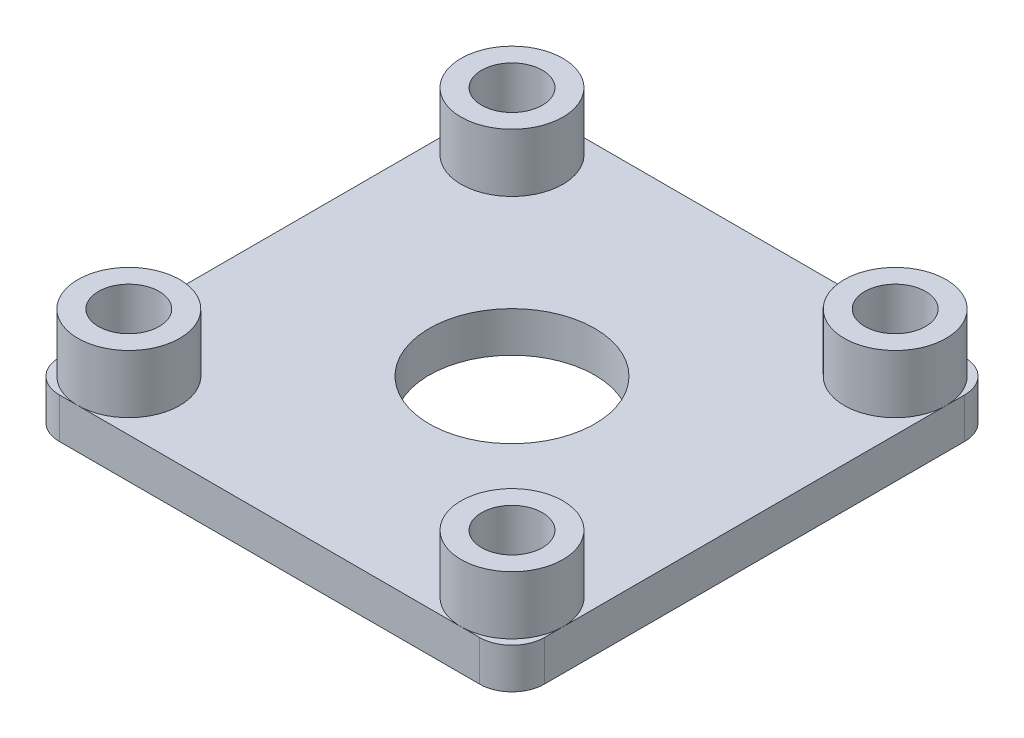
ISO-10303-21;
HEADER;
FILE_DESCRIPTION(('STEP AP214'),'2;1');
FILE_NAME('part.step','',(''),(''),'','','');
FILE_SCHEMA(('AUTOMOTIVE_DESIGN { 1 0 10303 214 1 1 1 1 }'));
ENDSEC;
DATA;
#1=APPLICATION_CONTEXT('core data for automotive mechanical design processes');
#2=APPLICATION_PROTOCOL_DEFINITION('international standard','automotive_design',2000,#1);
#3=PRODUCT_CONTEXT('',#1,'mechanical');
#4=PRODUCT('Part','Part','',(#3));
#5=PRODUCT_RELATED_PRODUCT_CATEGORY('part','',(#4));
#6=PRODUCT_DEFINITION_FORMATION('','',#4);
#7=PRODUCT_DEFINITION_CONTEXT('part definition',#1,'design');
#8=PRODUCT_DEFINITION('design','',#6,#7);
#9=PRODUCT_DEFINITION_SHAPE('','',#8);
#10=(LENGTH_UNIT() NAMED_UNIT(*) SI_UNIT(.MILLI.,.METRE.));
#11=(NAMED_UNIT(*) PLANE_ANGLE_UNIT() SI_UNIT($,.RADIAN.));
#12=(NAMED_UNIT(*) SI_UNIT($,.STERADIAN.) SOLID_ANGLE_UNIT());
#13=UNCERTAINTY_MEASURE_WITH_UNIT(LENGTH_MEASURE(1.E-05),#10,'distance_accuracy_value','');
#14=(GEOMETRIC_REPRESENTATION_CONTEXT(3) GLOBAL_UNCERTAINTY_ASSIGNED_CONTEXT((#13)) GLOBAL_UNIT_ASSIGNED_CONTEXT((#10,
#11,#12)) REPRESENTATION_CONTEXT('',''));
#15=CARTESIAN_POINT('',(0.,0.,0.));
#16=DIRECTION('',(0.,0.,1.));
#17=DIRECTION('',(1.,0.,0.));
#18=AXIS2_PLACEMENT_3D('',#15,#16,#17);
#19=CARTESIAN_POINT('',(15.0499999999988,8.13870849898768,-15.0500000000033));
#20=DIRECTION('',(0.,-1.,0.));
#21=DIRECTION('',(1.,0.,0.));
#22=AXIS2_PLACEMENT_3D('',#19,#20,#21);
#23=CYLINDRICAL_SURFACE('',#22,4.00000000000103);
#24=CARTESIAN_POINT('',(15.0499999999988,-32.512,-15.0500000000033));
#25=DIRECTION('',(0.,1.,0.));
#26=DIRECTION('',(-1.,0.,0.));
#27=AXIS2_PLACEMENT_3D('',#24,#25,#26);
#28=CIRCLE('',#27,4.00000000000103);
#29=CARTESIAN_POINT('',(11.0499999999978,-32.512,-15.0500000000032));
#30=VERTEX_POINT('',#29);
#31=EDGE_CURVE('E58',#30,#30,#28,.T.);
#32=ORIENTED_EDGE('',*,*,#31,.T.);
#33=EDGE_LOOP('',(#32));
#34=FACE_BOUND('',#33,.T.);
#35=CARTESIAN_POINT('',(15.0499999999988,-27.94,-15.0500000000033));
#36=DIRECTION('',(0.,1.,0.));
#37=DIRECTION('',(-1.,0.,0.));
#38=AXIS2_PLACEMENT_3D('',#35,#36,#37);
#39=CIRCLE('',#38,4.00000000000103);
#40=CARTESIAN_POINT('',(11.0499999999978,-27.94,-15.0500000000032));
#41=VERTEX_POINT('',#40);
#42=EDGE_CURVE('E12',#41,#41,#39,.T.);
#43=ORIENTED_EDGE('',*,*,#42,.F.);
#44=EDGE_LOOP('',(#43));
#45=FACE_BOUND('',#44,.T.);
#46=ADVANCED_FACE('F51',(#34,#45),#23,.T.);
#47=CARTESIAN_POINT('',(15.0499999999988,-32.512,-15.0500000000033));
#48=DIRECTION('',(0.,1.,0.));
#49=DIRECTION('',(-1.,0.,0.));
#50=AXIS2_PLACEMENT_3D('',#47,#48,#49);
#51=PLANE('',#50);
#52=ORIENTED_EDGE('',*,*,#31,.F.);
#53=EDGE_LOOP('',(#52));
#54=FACE_BOUND('',#53,.T.);
#55=CARTESIAN_POINT('',(15.0499999999988,-32.512,-15.0500000000033));
#56=DIRECTION('',(0.,1.,0.));
#57=DIRECTION('',(-1.,0.,0.));
#58=AXIS2_PLACEMENT_3D('',#55,#56,#57);
#59=CIRCLE('',#58,2.3876);
#60=CARTESIAN_POINT('',(12.6623999999988,-32.512,-15.0500000000032));
#61=VERTEX_POINT('',#60);
#62=EDGE_CURVE('E63',#61,#61,#59,.T.);
#63=ORIENTED_EDGE('',*,*,#62,.T.);
#64=EDGE_LOOP('',(#63));
#65=FACE_BOUND('',#64,.T.);
#66=ADVANCED_FACE('F79',(#54,#65),#51,.F.);
#67=CARTESIAN_POINT('',(15.0499999999988,8.13870849898768,-15.0500000000033));
#68=DIRECTION('',(0.,-1.,0.));
#69=DIRECTION('',(1.,0.,0.));
#70=AXIS2_PLACEMENT_3D('',#67,#68,#69);
#71=CYLINDRICAL_SURFACE('',#70,2.3876);
#72=ORIENTED_EDGE('',*,*,#62,.F.);
#73=EDGE_LOOP('',(#72));
#74=FACE_BOUND('',#73,.T.);
#75=CARTESIAN_POINT('',(15.0499999999988,-27.94,-15.0500000000033));
#76=DIRECTION('',(0.,1.,0.));
#77=DIRECTION('',(-1.,0.,0.));
#78=AXIS2_PLACEMENT_3D('',#75,#76,#77);
#79=CIRCLE('',#78,2.3876);
#80=CARTESIAN_POINT('',(12.6623999999988,-27.94,-15.0500000000032));
#81=VERTEX_POINT('',#80);
#82=EDGE_CURVE('E54',#81,#81,#79,.T.);
#83=ORIENTED_EDGE('',*,*,#82,.T.);
#84=EDGE_LOOP('',(#83));
#85=FACE_BOUND('',#84,.T.);
#86=ADVANCED_FACE('F71',(#74,#85),#71,.F.);
#87=CARTESIAN_POINT('',(0.,-27.94,0.));
#88=DIRECTION('',(0.,1.,0.));
#89=DIRECTION('',(-1.,0.,0.));
#90=AXIS2_PLACEMENT_3D('',#87,#88,#89);
#91=PLANE('',#90);
#92=ORIENTED_EDGE('',*,*,#82,.F.);
#93=EDGE_LOOP('',(#92));
#94=FACE_BOUND('',#93,.T.);
#95=ORIENTED_EDGE('',*,*,#42,.T.);
#96=EDGE_LOOP('',(#95));
#97=FACE_BOUND('',#96,.T.);
#98=ADVANCED_FACE('F73',(#94,#97),#91,.T.);
#99=CLOSED_SHELL('',(#46,#66,#86,#98));
#100=MANIFOLD_SOLID_BREP('B2',#99);
#101=CARTESIAN_POINT('',(15.0500000000031,8.13870849898768,15.049999999999));
#102=DIRECTION('',(0.,-1.,0.));
#103=DIRECTION('',(0.,0.,1.));
#104=AXIS2_PLACEMENT_3D('',#101,#102,#103);
#105=CYLINDRICAL_SURFACE('',#104,4.00000000000103);
#106=CARTESIAN_POINT('',(15.0500000000031,-32.512,15.049999999999));
#107=DIRECTION('',(0.,1.,0.));
#108=DIRECTION('',(0.,0.,-1.));
#109=AXIS2_PLACEMENT_3D('',#106,#107,#108);
#110=CIRCLE('',#109,4.00000000000103);
#111=CARTESIAN_POINT('',(15.0500000000031,-32.512,11.0499999999979));
#112=VERTEX_POINT('',#111);
#113=EDGE_CURVE('E158',#112,#112,#110,.T.);
#114=ORIENTED_EDGE('',*,*,#113,.T.);
#115=EDGE_LOOP('',(#114));
#116=FACE_BOUND('',#115,.T.);
#117=CARTESIAN_POINT('',(15.0500000000031,-27.94,15.049999999999));
#118=DIRECTION('',(0.,1.,0.));
#119=DIRECTION('',(0.,0.,-1.));
#120=AXIS2_PLACEMENT_3D('',#117,#118,#119);
#121=CIRCLE('',#120,4.00000000000103);
#122=CARTESIAN_POINT('',(15.0500000000031,-27.94,11.0499999999979));
#123=VERTEX_POINT('',#122);
#124=EDGE_CURVE('E50',#123,#123,#121,.T.);
#125=ORIENTED_EDGE('',*,*,#124,.F.);
#126=EDGE_LOOP('',(#125));
#127=FACE_BOUND('',#126,.T.);
#128=ADVANCED_FACE('F151',(#116,#127),#105,.T.);
#129=CARTESIAN_POINT('',(15.0500000000031,-32.512,15.049999999999));
#130=DIRECTION('',(0.,1.,0.));
#131=DIRECTION('',(0.,0.,-1.));
#132=AXIS2_PLACEMENT_3D('',#129,#130,#131);
#133=PLANE('',#132);
#134=ORIENTED_EDGE('',*,*,#113,.F.);
#135=EDGE_LOOP('',(#134));
#136=FACE_BOUND('',#135,.T.);
#137=CARTESIAN_POINT('',(15.0500000000031,-32.512,15.049999999999));
#138=DIRECTION('',(0.,1.,0.));
#139=DIRECTION('',(0.,0.,-1.));
#140=AXIS2_PLACEMENT_3D('',#137,#138,#139);
#141=CIRCLE('',#140,2.3876);
#142=CARTESIAN_POINT('',(15.0500000000031,-32.512,12.662399999999));
#143=VERTEX_POINT('',#142);
#144=EDGE_CURVE('E163',#143,#143,#141,.T.);
#145=ORIENTED_EDGE('',*,*,#144,.T.);
#146=EDGE_LOOP('',(#145));
#147=FACE_BOUND('',#146,.T.);
#148=ADVANCED_FACE('F179',(#136,#147),#133,.F.);
#149=CARTESIAN_POINT('',(15.0500000000031,8.13870849898768,15.049999999999));
#150=DIRECTION('',(0.,-1.,0.));
#151=DIRECTION('',(0.,0.,1.));
#152=AXIS2_PLACEMENT_3D('',#149,#150,#151);
#153=CYLINDRICAL_SURFACE('',#152,2.3876);
#154=ORIENTED_EDGE('',*,*,#144,.F.);
#155=EDGE_LOOP('',(#154));
#156=FACE_BOUND('',#155,.T.);
#157=CARTESIAN_POINT('',(15.0500000000031,-27.94,15.049999999999));
#158=DIRECTION('',(0.,1.,0.));
#159=DIRECTION('',(0.,0.,-1.));
#160=AXIS2_PLACEMENT_3D('',#157,#158,#159);
#161=CIRCLE('',#160,2.3876);
#162=CARTESIAN_POINT('',(15.0500000000031,-27.94,12.662399999999));
#163=VERTEX_POINT('',#162);
#164=EDGE_CURVE('E154',#163,#163,#161,.T.);
#165=ORIENTED_EDGE('',*,*,#164,.T.);
#166=EDGE_LOOP('',(#165));
#167=FACE_BOUND('',#166,.T.);
#168=ADVANCED_FACE('F171',(#156,#167),#153,.F.);
#169=CARTESIAN_POINT('',(0.,-27.94,0.));
#170=DIRECTION('',(0.,1.,0.));
#171=DIRECTION('',(0.,0.,-1.));
#172=AXIS2_PLACEMENT_3D('',#169,#170,#171);
#173=PLANE('',#172);
#174=ORIENTED_EDGE('',*,*,#164,.F.);
#175=EDGE_LOOP('',(#174));
#176=FACE_BOUND('',#175,.T.);
#177=ORIENTED_EDGE('',*,*,#124,.T.);
#178=EDGE_LOOP('',(#177));
#179=FACE_BOUND('',#178,.T.);
#180=ADVANCED_FACE('F173',(#176,#179),#173,.T.);
#181=CLOSED_SHELL('',(#128,#148,#168,#180));
#182=MANIFOLD_SOLID_BREP('B7',#181);
#183=CARTESIAN_POINT('',(-15.0499999999989,8.13870849898768,15.0500000000032));
#184=DIRECTION('',(0.,-1.,0.));
#185=DIRECTION('',(-1.,0.,0.));
#186=AXIS2_PLACEMENT_3D('',#183,#184,#185);
#187=CYLINDRICAL_SURFACE('',#186,4.00000000000103);
#188=CARTESIAN_POINT('',(-15.0499999999989,-32.512,15.0500000000032));
#189=DIRECTION('',(0.,1.,0.));
#190=DIRECTION('',(1.,0.,0.));
#191=AXIS2_PLACEMENT_3D('',#188,#189,#190);
#192=CIRCLE('',#191,4.00000000000103);
#193=CARTESIAN_POINT('',(-11.0499999999979,-32.512,15.0500000000031));
#194=VERTEX_POINT('',#193);
#195=EDGE_CURVE('E258',#194,#194,#192,.T.);
#196=ORIENTED_EDGE('',*,*,#195,.T.);
#197=EDGE_LOOP('',(#196));
#198=FACE_BOUND('',#197,.T.);
#199=CARTESIAN_POINT('',(-15.0499999999989,-27.94,15.0500000000032));
#200=DIRECTION('',(0.,1.,0.));
#201=DIRECTION('',(1.,0.,0.));
#202=AXIS2_PLACEMENT_3D('',#199,#200,#201);
#203=CIRCLE('',#202,4.00000000000103);
#204=CARTESIAN_POINT('',(-11.0499999999979,-27.94,15.0500000000031));
#205=VERTEX_POINT('',#204);
#206=EDGE_CURVE('E150',#205,#205,#203,.T.);
#207=ORIENTED_EDGE('',*,*,#206,.F.);
#208=EDGE_LOOP('',(#207));
#209=FACE_BOUND('',#208,.T.);
#210=ADVANCED_FACE('F251',(#198,#209),#187,.T.);
#211=CARTESIAN_POINT('',(-15.0499999999989,-32.512,15.0500000000032));
#212=DIRECTION('',(0.,1.,0.));
#213=DIRECTION('',(1.,0.,0.));
#214=AXIS2_PLACEMENT_3D('',#211,#212,#213);
#215=PLANE('',#214);
#216=ORIENTED_EDGE('',*,*,#195,.F.);
#217=EDGE_LOOP('',(#216));
#218=FACE_BOUND('',#217,.T.);
#219=CARTESIAN_POINT('',(-15.0499999999989,-32.512,15.0500000000032));
#220=DIRECTION('',(0.,1.,0.));
#221=DIRECTION('',(1.,0.,0.));
#222=AXIS2_PLACEMENT_3D('',#219,#220,#221);
#223=CIRCLE('',#222,2.3876);
#224=CARTESIAN_POINT('',(-12.6623999999989,-32.512,15.0500000000032));
#225=VERTEX_POINT('',#224);
#226=EDGE_CURVE('E263',#225,#225,#223,.T.);
#227=ORIENTED_EDGE('',*,*,#226,.T.);
#228=EDGE_LOOP('',(#227));
#229=FACE_BOUND('',#228,.T.);
#230=ADVANCED_FACE('F279',(#218,#229),#215,.F.);
#231=CARTESIAN_POINT('',(-15.0499999999989,8.13870849898768,15.0500000000032));
#232=DIRECTION('',(0.,-1.,0.));
#233=DIRECTION('',(-1.,0.,0.));
#234=AXIS2_PLACEMENT_3D('',#231,#232,#233);
#235=CYLINDRICAL_SURFACE('',#234,2.3876);
#236=ORIENTED_EDGE('',*,*,#226,.F.);
#237=EDGE_LOOP('',(#236));
#238=FACE_BOUND('',#237,.T.);
#239=CARTESIAN_POINT('',(-15.0499999999989,-27.94,15.0500000000032));
#240=DIRECTION('',(0.,1.,0.));
#241=DIRECTION('',(1.,0.,0.));
#242=AXIS2_PLACEMENT_3D('',#239,#240,#241);
#243=CIRCLE('',#242,2.3876);
#244=CARTESIAN_POINT('',(-12.6623999999989,-27.94,15.0500000000032));
#245=VERTEX_POINT('',#244);
#246=EDGE_CURVE('E254',#245,#245,#243,.T.);
#247=ORIENTED_EDGE('',*,*,#246,.T.);
#248=EDGE_LOOP('',(#247));
#249=FACE_BOUND('',#248,.T.);
#250=ADVANCED_FACE('F271',(#238,#249),#235,.F.);
#251=CARTESIAN_POINT('',(0.,-27.94,0.));
#252=DIRECTION('',(0.,1.,0.));
#253=DIRECTION('',(1.,0.,0.));
#254=AXIS2_PLACEMENT_3D('',#251,#252,#253);
#255=PLANE('',#254);
#256=ORIENTED_EDGE('',*,*,#246,.F.);
#257=EDGE_LOOP('',(#256));
#258=FACE_BOUND('',#257,.T.);
#259=ORIENTED_EDGE('',*,*,#206,.T.);
#260=EDGE_LOOP('',(#259));
#261=FACE_BOUND('',#260,.T.);
#262=ADVANCED_FACE('F273',(#258,#261),#255,.T.);
#263=CLOSED_SHELL('',(#210,#230,#250,#262));
#264=MANIFOLD_SOLID_BREP('B45',#263);
#265=CARTESIAN_POINT('',(-15.0500000000031,8.13870849898768,-15.049999999999));
#266=DIRECTION('',(0.,-1.,0.));
#267=DIRECTION('',(0.,0.,-1.));
#268=AXIS2_PLACEMENT_3D('',#265,#266,#267);
#269=CYLINDRICAL_SURFACE('',#268,4.00000000000103);
#270=CARTESIAN_POINT('',(-15.0500000000031,-32.512,-15.049999999999));
#271=DIRECTION('',(0.,1.,0.));
#272=DIRECTION('',(0.,0.,1.));
#273=AXIS2_PLACEMENT_3D('',#270,#271,#272);
#274=CIRCLE('',#273,4.00000000000103);
#275=CARTESIAN_POINT('',(-15.0500000000031,-32.512,-11.0499999999979));
#276=VERTEX_POINT('',#275);
#277=EDGE_CURVE('E359',#276,#276,#274,.T.);
#278=ORIENTED_EDGE('',*,*,#277,.T.);
#279=EDGE_LOOP('',(#278));
#280=FACE_BOUND('',#279,.T.);
#281=CARTESIAN_POINT('',(-15.0500000000031,-27.94,-15.049999999999));
#282=DIRECTION('',(0.,1.,0.));
#283=DIRECTION('',(0.,0.,1.));
#284=AXIS2_PLACEMENT_3D('',#281,#282,#283);
#285=CIRCLE('',#284,4.00000000000103);
#286=CARTESIAN_POINT('',(-15.0500000000031,-27.94,-11.0499999999979));
#287=VERTEX_POINT('',#286);
#288=EDGE_CURVE('E250',#287,#287,#285,.T.);
#289=ORIENTED_EDGE('',*,*,#288,.F.);
#290=EDGE_LOOP('',(#289));
#291=FACE_BOUND('',#290,.T.);
#292=ADVANCED_FACE('F352',(#280,#291),#269,.T.);
#293=CARTESIAN_POINT('',(-15.0500000000031,-32.512,-15.049999999999));
#294=DIRECTION('',(0.,1.,0.));
#295=DIRECTION('',(0.,0.,1.));
#296=AXIS2_PLACEMENT_3D('',#293,#294,#295);
#297=PLANE('',#296);
#298=ORIENTED_EDGE('',*,*,#277,.F.);
#299=EDGE_LOOP('',(#298));
#300=FACE_BOUND('',#299,.T.);
#301=CARTESIAN_POINT('',(-15.0500000000031,-32.512,-15.049999999999));
#302=DIRECTION('',(0.,1.,0.));
#303=DIRECTION('',(0.,0.,1.));
#304=AXIS2_PLACEMENT_3D('',#301,#302,#303);
#305=CIRCLE('',#304,2.3876);
#306=CARTESIAN_POINT('',(-15.0500000000031,-32.512,-12.662399999999));
#307=VERTEX_POINT('',#306);
#308=EDGE_CURVE('E364',#307,#307,#305,.T.);
#309=ORIENTED_EDGE('',*,*,#308,.T.);
#310=EDGE_LOOP('',(#309));
#311=FACE_BOUND('',#310,.T.);
#312=ADVANCED_FACE('F380',(#300,#311),#297,.F.);
#313=CARTESIAN_POINT('',(-15.0500000000031,8.13870849898768,-15.049999999999));
#314=DIRECTION('',(0.,-1.,0.));
#315=DIRECTION('',(0.,0.,-1.));
#316=AXIS2_PLACEMENT_3D('',#313,#314,#315);
#317=CYLINDRICAL_SURFACE('',#316,2.3876);
#318=ORIENTED_EDGE('',*,*,#308,.F.);
#319=EDGE_LOOP('',(#318));
#320=FACE_BOUND('',#319,.T.);
#321=CARTESIAN_POINT('',(-15.0500000000031,-27.94,-15.049999999999));
#322=DIRECTION('',(0.,1.,0.));
#323=DIRECTION('',(0.,0.,1.));
#324=AXIS2_PLACEMENT_3D('',#321,#322,#323);
#325=CIRCLE('',#324,2.3876);
#326=CARTESIAN_POINT('',(-15.0500000000031,-27.94,-12.662399999999));
#327=VERTEX_POINT('',#326);
#328=EDGE_CURVE('E355',#327,#327,#325,.T.);
#329=ORIENTED_EDGE('',*,*,#328,.T.);
#330=EDGE_LOOP('',(#329));
#331=FACE_BOUND('',#330,.T.);
#332=ADVANCED_FACE('F372',(#320,#331),#317,.F.);
#333=CARTESIAN_POINT('',(0.,-27.94,0.));
#334=DIRECTION('',(0.,1.,0.));
#335=DIRECTION('',(0.,0.,1.));
#336=AXIS2_PLACEMENT_3D('',#333,#334,#335);
#337=PLANE('',#336);
#338=ORIENTED_EDGE('',*,*,#328,.F.);
#339=EDGE_LOOP('',(#338));
#340=FACE_BOUND('',#339,.T.);
#341=ORIENTED_EDGE('',*,*,#288,.T.);
#342=EDGE_LOOP('',(#341));
#343=FACE_BOUND('',#342,.T.);
#344=ADVANCED_FACE('F374',(#340,#343),#337,.T.);
#345=CLOSED_SHELL('',(#292,#312,#332,#344));
#346=MANIFOLD_SOLID_BREP('B145',#345);
#347=CARTESIAN_POINT('',(0.,-35.687,0.));
#348=DIRECTION('',(0.,1.,0.));
#349=DIRECTION('',(0.,0.,1.));
#350=AXIS2_PLACEMENT_3D('',#347,#348,#349);
#351=PLANE('',#350);
#352=DIRECTION('',(-1.,0.,0.));
#353=VECTOR('',#352,1.);
#354=CARTESIAN_POINT('',(-19.05,-35.687,19.05));
#355=LINE('',#354,#353);
#356=CARTESIAN_POINT('',(16.51,-35.687,19.05));
#357=VERTEX_POINT('',#356);
#358=CARTESIAN_POINT('',(-16.51,-35.687,19.05));
#359=VERTEX_POINT('',#358);
#360=EDGE_CURVE('E525',#357,#359,#355,.T.);
#361=ORIENTED_EDGE('',*,*,#360,.T.);
#362=CARTESIAN_POINT('',(-16.51,-35.687,16.51));
#363=DIRECTION('',(0.,1.,0.));
#364=DIRECTION('',(0.,0.,1.));
#365=AXIS2_PLACEMENT_3D('',#362,#363,#364);
#366=CIRCLE('',#365,2.54);
#367=CARTESIAN_POINT('',(-19.05,-35.687,16.51));
#368=VERTEX_POINT('',#367);
#369=EDGE_CURVE('E544',#359,#368,#366,.F.);
#370=ORIENTED_EDGE('',*,*,#369,.T.);
#371=DIRECTION('',(0.,0.,-1.));
#372=VECTOR('',#371,1.);
#373=CARTESIAN_POINT('',(-19.05,-35.687,-19.05));
#374=LINE('',#373,#372);
#375=CARTESIAN_POINT('',(-19.05,-35.687,-16.51));
#376=VERTEX_POINT('',#375);
#377=EDGE_CURVE('E508',#368,#376,#374,.T.);
#378=ORIENTED_EDGE('',*,*,#377,.T.);
#379=CARTESIAN_POINT('',(-16.51,-35.687,-16.51));
#380=DIRECTION('',(0.,1.,0.));
#381=DIRECTION('',(0.,0.,1.));
#382=AXIS2_PLACEMENT_3D('',#379,#380,#381);
#383=CIRCLE('',#382,2.54);
#384=CARTESIAN_POINT('',(-16.51,-35.687,-19.05));
#385=VERTEX_POINT('',#384);
#386=EDGE_CURVE('E542',#376,#385,#383,.F.);
#387=ORIENTED_EDGE('',*,*,#386,.T.);
#388=DIRECTION('',(1.,0.,0.));
#389=VECTOR('',#388,1.);
#390=CARTESIAN_POINT('',(-19.05,-35.687,-19.05));
#391=LINE('',#390,#389);
#392=CARTESIAN_POINT('',(16.51,-35.687,-19.05));
#393=VERTEX_POINT('',#392);
#394=EDGE_CURVE('E555',#385,#393,#391,.T.);
#395=ORIENTED_EDGE('',*,*,#394,.T.);
#396=CARTESIAN_POINT('',(16.51,-35.687,-16.51));
#397=DIRECTION('',(0.,1.,0.));
#398=DIRECTION('',(0.,0.,1.));
#399=AXIS2_PLACEMENT_3D('',#396,#397,#398);
#400=CIRCLE('',#399,2.54);
#401=CARTESIAN_POINT('',(19.05,-35.687,-16.51));
#402=VERTEX_POINT('',#401);
#403=EDGE_CURVE('E443',#393,#402,#400,.F.);
#404=ORIENTED_EDGE('',*,*,#403,.T.);
#405=DIRECTION('',(0.,0.,1.));
#406=VECTOR('',#405,1.);
#407=CARTESIAN_POINT('',(19.05,-35.687,-19.05));
#408=LINE('',#407,#406);
#409=CARTESIAN_POINT('',(19.05,-35.687,16.51));
#410=VERTEX_POINT('',#409);
#411=EDGE_CURVE('E563',#402,#410,#408,.T.);
#412=ORIENTED_EDGE('',*,*,#411,.T.);
#413=CARTESIAN_POINT('',(16.51,-35.687,16.51));
#414=DIRECTION('',(0.,1.,0.));
#415=DIRECTION('',(0.,0.,1.));
#416=AXIS2_PLACEMENT_3D('',#413,#414,#415);
#417=CIRCLE('',#416,2.54);
#418=EDGE_CURVE('E539',#410,#357,#417,.F.);
#419=ORIENTED_EDGE('',*,*,#418,.T.);
#420=EDGE_LOOP('',(#361,#370,#378,#387,#395,#404,#412,#419));
#421=FACE_BOUND('',#420,.T.);
#422=CARTESIAN_POINT('',(15.0499999999997,-35.687,-15.0500000000024));
#423=DIRECTION('',(0.,-1.,0.));
#424=DIRECTION('',(0.,0.,-1.));
#425=AXIS2_PLACEMENT_3D('',#422,#423,#424);
#426=CIRCLE('',#425,2.15265);
#427=CARTESIAN_POINT('',(15.0499999999997,-35.687,-17.2026500000024));
#428=VERTEX_POINT('',#427);
#429=EDGE_CURVE('E516',#428,#428,#426,.T.);
#430=ORIENTED_EDGE('',*,*,#429,.F.);
#431=EDGE_LOOP('',(#430));
#432=FACE_BOUND('',#431,.T.);
#433=CARTESIAN_POINT('',(-15.0500000000031,-35.687,-15.049999999999));
#434=DIRECTION('',(0.,-1.,0.));
#435=DIRECTION('',(0.,0.,-1.));
#436=AXIS2_PLACEMENT_3D('',#433,#434,#435);
#437=CIRCLE('',#436,2.15265);
#438=CARTESIAN_POINT('',(-15.0500000000031,-35.687,-17.202649999999));
#439=VERTEX_POINT('',#438);
#440=EDGE_CURVE('E570',#439,#439,#437,.T.);
#441=ORIENTED_EDGE('',*,*,#440,.F.);
#442=EDGE_LOOP('',(#441));
#443=FACE_BOUND('',#442,.T.);
#444=CARTESIAN_POINT('',(-15.050000000001,-35.687,15.050000000001));
#445=DIRECTION('',(0.,-1.,0.));
#446=DIRECTION('',(0.,0.,-1.));
#447=AXIS2_PLACEMENT_3D('',#444,#445,#446);
#448=CIRCLE('',#447,2.15265);
#449=CARTESIAN_POINT('',(-15.050000000001,-35.687,12.897350000001));
#450=VERTEX_POINT('',#449);
#451=EDGE_CURVE('E575',#450,#450,#448,.T.);
#452=ORIENTED_EDGE('',*,*,#451,.F.);
#453=EDGE_LOOP('',(#452));
#454=FACE_BOUND('',#453,.T.);
#455=CARTESIAN_POINT('',(15.0500000000017,-35.687,15.0500000000003));
#456=DIRECTION('',(0.,-1.,0.));
#457=DIRECTION('',(0.,0.,-1.));
#458=AXIS2_PLACEMENT_3D('',#455,#456,#457);
#459=CIRCLE('',#458,2.15265);
#460=CARTESIAN_POINT('',(15.0500000000017,-35.687,12.8973500000003));
#461=VERTEX_POINT('',#460);
#462=EDGE_CURVE('E581',#461,#461,#459,.T.);
#463=ORIENTED_EDGE('',*,*,#462,.F.);
#464=EDGE_LOOP('',(#463));
#465=FACE_BOUND('',#464,.T.);
#466=CARTESIAN_POINT('',(0.,-35.687,0.));
#467=DIRECTION('',(0.,-1.,0.));
#468=DIRECTION('',(0.,0.,-1.));
#469=AXIS2_PLACEMENT_3D('',#466,#467,#468);
#470=CIRCLE('',#469,6.5);
#471=CARTESIAN_POINT('',(0.,-35.687,-6.5));
#472=VERTEX_POINT('',#471);
#473=EDGE_CURVE('E587',#472,#472,#470,.T.);
#474=ORIENTED_EDGE('',*,*,#473,.F.);
#475=EDGE_LOOP('',(#474));
#476=FACE_BOUND('',#475,.T.);
#477=ADVANCED_FACE('F422',(#421,#432,#443,#454,#465,#476),#351,.F.);
#478=CARTESIAN_POINT('',(0.,-32.512,0.));
#479=DIRECTION('',(0.,1.,0.));
#480=DIRECTION('',(0.,0.,1.));
#481=AXIS2_PLACEMENT_3D('',#478,#479,#480);
#482=PLANE('',#481);
#483=CARTESIAN_POINT('',(15.0500000000017,-32.512,15.0500000000003));
#484=DIRECTION('',(0.,-1.,0.));
#485=DIRECTION('',(0.,0.,-1.));
#486=AXIS2_PLACEMENT_3D('',#483,#484,#485);
#487=CIRCLE('',#486,2.15265);
#488=CARTESIAN_POINT('',(15.0500000000017,-32.512,12.8973500000003));
#489=VERTEX_POINT('',#488);
#490=EDGE_CURVE('E584',#489,#489,#487,.T.);
#491=ORIENTED_EDGE('',*,*,#490,.T.);
#492=EDGE_LOOP('',(#491));
#493=FACE_BOUND('',#492,.T.);
#494=CARTESIAN_POINT('',(-15.0500000000031,-32.512,-15.049999999999));
#495=DIRECTION('',(0.,-1.,0.));
#496=DIRECTION('',(0.,0.,-1.));
#497=AXIS2_PLACEMENT_3D('',#494,#495,#496);
#498=CIRCLE('',#497,2.15265);
#499=CARTESIAN_POINT('',(-15.0500000000031,-32.512,-17.202649999999));
#500=VERTEX_POINT('',#499);
#501=EDGE_CURVE('E572',#500,#500,#498,.T.);
#502=ORIENTED_EDGE('',*,*,#501,.T.);
#503=EDGE_LOOP('',(#502));
#504=FACE_BOUND('',#503,.T.);
#505=DIRECTION('',(0.,0.,-1.));
#506=VECTOR('',#505,1.);
#507=CARTESIAN_POINT('',(-19.05,-32.512,-19.05));
#508=LINE('',#507,#506);
#509=CARTESIAN_POINT('',(-19.05,-32.512,16.51));
#510=VERTEX_POINT('',#509);
#511=CARTESIAN_POINT('',(-19.05,-32.512,-16.51));
#512=VERTEX_POINT('',#511);
#513=EDGE_CURVE('E505',#510,#512,#508,.T.);
#514=ORIENTED_EDGE('',*,*,#513,.F.);
#515=CARTESIAN_POINT('',(-16.51,-32.512,16.51));
#516=DIRECTION('',(0.,1.,0.));
#517=DIRECTION('',(0.,0.,1.));
#518=AXIS2_PLACEMENT_3D('',#515,#516,#517);
#519=CIRCLE('',#518,2.54);
#520=CARTESIAN_POINT('',(-16.51,-32.512,19.05));
#521=VERTEX_POINT('',#520);
#522=EDGE_CURVE('E488',#510,#521,#519,.T.);
#523=ORIENTED_EDGE('',*,*,#522,.T.);
#524=DIRECTION('',(-1.,0.,0.));
#525=VECTOR('',#524,1.);
#526=CARTESIAN_POINT('',(-19.05,-32.512,19.05));
#527=LINE('',#526,#525);
#528=CARTESIAN_POINT('',(16.51,-32.512,19.05));
#529=VERTEX_POINT('',#528);
#530=EDGE_CURVE('E529',#529,#521,#527,.T.);
#531=ORIENTED_EDGE('',*,*,#530,.F.);
#532=CARTESIAN_POINT('',(16.51,-32.512,16.51));
#533=DIRECTION('',(0.,1.,0.));
#534=DIRECTION('',(0.,0.,1.));
#535=AXIS2_PLACEMENT_3D('',#532,#533,#534);
#536=CIRCLE('',#535,2.54);
#537=CARTESIAN_POINT('',(19.05,-32.512,16.51));
#538=VERTEX_POINT('',#537);
#539=EDGE_CURVE('E509',#529,#538,#536,.T.);
#540=ORIENTED_EDGE('',*,*,#539,.T.);
#541=DIRECTION('',(0.,0.,1.));
#542=VECTOR('',#541,1.);
#543=CARTESIAN_POINT('',(19.05,-32.512,-19.05));
#544=LINE('',#543,#542);
#545=CARTESIAN_POINT('',(19.05,-32.512,-16.51));
#546=VERTEX_POINT('',#545);
#547=EDGE_CURVE('E519',#546,#538,#544,.T.);
#548=ORIENTED_EDGE('',*,*,#547,.F.);
#549=CARTESIAN_POINT('',(16.51,-32.512,-16.51));
#550=DIRECTION('',(0.,1.,0.));
#551=DIRECTION('',(0.,0.,1.));
#552=AXIS2_PLACEMENT_3D('',#549,#550,#551);
#553=CIRCLE('',#552,2.54);
#554=CARTESIAN_POINT('',(16.51,-32.512,-19.05));
#555=VERTEX_POINT('',#554);
#556=EDGE_CURVE('E533',#546,#555,#553,.T.);
#557=ORIENTED_EDGE('',*,*,#556,.T.);
#558=DIRECTION('',(1.,0.,0.));
#559=VECTOR('',#558,1.);
#560=CARTESIAN_POINT('',(-19.05,-32.512,-19.05));
#561=LINE('',#560,#559);
#562=CARTESIAN_POINT('',(-16.51,-32.512,-19.05));
#563=VERTEX_POINT('',#562);
#564=EDGE_CURVE('E515',#563,#555,#561,.T.);
#565=ORIENTED_EDGE('',*,*,#564,.F.);
#566=CARTESIAN_POINT('',(-16.51,-32.512,-16.51));
#567=DIRECTION('',(0.,1.,0.));
#568=DIRECTION('',(0.,0.,1.));
#569=AXIS2_PLACEMENT_3D('',#566,#567,#568);
#570=CIRCLE('',#569,2.54);
#571=EDGE_CURVE('E499',#563,#512,#570,.T.);
#572=ORIENTED_EDGE('',*,*,#571,.T.);
#573=EDGE_LOOP('',(#514,#523,#531,#540,#548,#557,#565,#572));
#574=FACE_BOUND('',#573,.T.);
#575=CARTESIAN_POINT('',(15.0499999999997,-32.512,-15.0500000000024));
#576=DIRECTION('',(0.,-1.,0.));
#577=DIRECTION('',(0.,0.,-1.));
#578=AXIS2_PLACEMENT_3D('',#575,#576,#577);
#579=CIRCLE('',#578,2.15265);
#580=CARTESIAN_POINT('',(15.0499999999997,-32.512,-17.2026500000024));
#581=VERTEX_POINT('',#580);
#582=EDGE_CURVE('E522',#581,#581,#579,.T.);
#583=ORIENTED_EDGE('',*,*,#582,.T.);
#584=EDGE_LOOP('',(#583));
#585=FACE_BOUND('',#584,.T.);
#586=CARTESIAN_POINT('',(-15.050000000001,-32.512,15.050000000001));
#587=DIRECTION('',(0.,-1.,0.));
#588=DIRECTION('',(0.,0.,-1.));
#589=AXIS2_PLACEMENT_3D('',#586,#587,#588);
#590=CIRCLE('',#589,2.15265);
#591=CARTESIAN_POINT('',(-15.050000000001,-32.512,12.897350000001));
#592=VERTEX_POINT('',#591);
#593=EDGE_CURVE('E578',#592,#592,#590,.T.);
#594=ORIENTED_EDGE('',*,*,#593,.T.);
#595=EDGE_LOOP('',(#594));
#596=FACE_BOUND('',#595,.T.);
#597=CARTESIAN_POINT('',(0.,-32.512,0.));
#598=DIRECTION('',(0.,-1.,0.));
#599=DIRECTION('',(0.,0.,-1.));
#600=AXIS2_PLACEMENT_3D('',#597,#598,#599);
#601=CIRCLE('',#600,6.5);
#602=CARTESIAN_POINT('',(0.,-32.512,-6.5));
#603=VERTEX_POINT('',#602);
#604=EDGE_CURVE('E590',#603,#603,#601,.T.);
#605=ORIENTED_EDGE('',*,*,#604,.T.);
#606=EDGE_LOOP('',(#605));
#607=FACE_BOUND('',#606,.T.);
#608=ADVANCED_FACE('F512',(#493,#504,#574,#585,#596,#607),#482,.T.);
#609=CARTESIAN_POINT('',(-19.05,-35.687,-19.05));
#610=DIRECTION('',(1.,0.,0.));
#611=DIRECTION('',(0.,0.,-1.));
#612=AXIS2_PLACEMENT_3D('',#609,#610,#611);
#613=PLANE('',#612);
#614=ORIENTED_EDGE('',*,*,#377,.F.);
#615=DIRECTION('',(0.,1.,0.));
#616=VECTOR('',#615,1.);
#617=CARTESIAN_POINT('',(-19.05,-35.687,16.51));
#618=LINE('',#617,#616);
#619=EDGE_CURVE('E492',#368,#510,#618,.T.);
#620=ORIENTED_EDGE('',*,*,#619,.T.);
#621=ORIENTED_EDGE('',*,*,#513,.T.);
#622=DIRECTION('',(0.,1.,0.));
#623=VECTOR('',#622,1.);
#624=CARTESIAN_POINT('',(-19.05,-35.687,-16.51));
#625=LINE('',#624,#623);
#626=EDGE_CURVE('E510',#512,#376,#625,.F.);
#627=ORIENTED_EDGE('',*,*,#626,.T.);
#628=EDGE_LOOP('',(#614,#620,#621,#627));
#629=FACE_BOUND('',#628,.T.);
#630=ADVANCED_FACE('F504',(#629),#613,.F.);
#631=CARTESIAN_POINT('',(-19.05,-35.687,-19.05));
#632=DIRECTION('',(0.,0.,1.));
#633=DIRECTION('',(1.,0.,0.));
#634=AXIS2_PLACEMENT_3D('',#631,#632,#633);
#635=PLANE('',#634);
#636=ORIENTED_EDGE('',*,*,#394,.F.);
#637=DIRECTION('',(0.,1.,0.));
#638=VECTOR('',#637,1.);
#639=CARTESIAN_POINT('',(-16.51,-35.687,-19.05));
#640=LINE('',#639,#638);
#641=EDGE_CURVE('E548',#385,#563,#640,.T.);
#642=ORIENTED_EDGE('',*,*,#641,.T.);
#643=ORIENTED_EDGE('',*,*,#564,.T.);
#644=DIRECTION('',(0.,1.,0.));
#645=VECTOR('',#644,1.);
#646=CARTESIAN_POINT('',(16.51,-35.687,-19.05));
#647=LINE('',#646,#645);
#648=EDGE_CURVE('E546',#555,#393,#647,.F.);
#649=ORIENTED_EDGE('',*,*,#648,.T.);
#650=EDGE_LOOP('',(#636,#642,#643,#649));
#651=FACE_BOUND('',#650,.T.);
#652=ADVANCED_FACE('F553',(#651),#635,.F.);
#653=CARTESIAN_POINT('',(19.05,-35.687,-19.05));
#654=DIRECTION('',(-1.,0.,0.));
#655=DIRECTION('',(0.,0.,1.));
#656=AXIS2_PLACEMENT_3D('',#653,#654,#655);
#657=PLANE('',#656);
#658=ORIENTED_EDGE('',*,*,#411,.F.);
#659=DIRECTION('',(0.,1.,0.));
#660=VECTOR('',#659,1.);
#661=CARTESIAN_POINT('',(19.05,-35.687,-16.51));
#662=LINE('',#661,#660);
#663=EDGE_CURVE('E350',#402,#546,#662,.T.);
#664=ORIENTED_EDGE('',*,*,#663,.T.);
#665=ORIENTED_EDGE('',*,*,#547,.T.);
#666=DIRECTION('',(0.,1.,0.));
#667=VECTOR('',#666,1.);
#668=CARTESIAN_POINT('',(19.05,-35.687,16.51));
#669=LINE('',#668,#667);
#670=EDGE_CURVE('E430',#538,#410,#669,.F.);
#671=ORIENTED_EDGE('',*,*,#670,.T.);
#672=EDGE_LOOP('',(#658,#664,#665,#671));
#673=FACE_BOUND('',#672,.T.);
#674=ADVANCED_FACE('F562',(#673),#657,.F.);
#675=CARTESIAN_POINT('',(-19.05,-35.687,19.05));
#676=DIRECTION('',(0.,0.,-1.));
#677=DIRECTION('',(-1.,0.,0.));
#678=AXIS2_PLACEMENT_3D('',#675,#676,#677);
#679=PLANE('',#678);
#680=ORIENTED_EDGE('',*,*,#530,.T.);
#681=DIRECTION('',(0.,1.,0.));
#682=VECTOR('',#681,1.);
#683=CARTESIAN_POINT('',(-16.51,-35.687,19.05));
#684=LINE('',#683,#682);
#685=EDGE_CURVE('E493',#521,#359,#684,.F.);
#686=ORIENTED_EDGE('',*,*,#685,.T.);
#687=ORIENTED_EDGE('',*,*,#360,.F.);
#688=DIRECTION('',(0.,1.,0.));
#689=VECTOR('',#688,1.);
#690=CARTESIAN_POINT('',(16.51,-35.687,19.05));
#691=LINE('',#690,#689);
#692=EDGE_CURVE('E498',#357,#529,#691,.T.);
#693=ORIENTED_EDGE('',*,*,#692,.T.);
#694=EDGE_LOOP('',(#680,#686,#687,#693));
#695=FACE_BOUND('',#694,.T.);
#696=ADVANCED_FACE('F611',(#695),#679,.F.);
#697=CARTESIAN_POINT('',(15.0499999999997,-35.687,-15.0500000000024));
#698=DIRECTION('',(0.,1.,0.));
#699=DIRECTION('',(0.,0.,1.));
#700=AXIS2_PLACEMENT_3D('',#697,#698,#699);
#701=CYLINDRICAL_SURFACE('',#700,2.15265);
#702=ORIENTED_EDGE('',*,*,#429,.T.);
#703=EDGE_LOOP('',(#702));
#704=FACE_BOUND('',#703,.T.);
#705=ORIENTED_EDGE('',*,*,#582,.F.);
#706=EDGE_LOOP('',(#705));
#707=FACE_BOUND('',#706,.T.);
#708=ADVANCED_FACE('F608',(#704,#707),#701,.F.);
#709=CARTESIAN_POINT('',(-15.0500000000031,-35.687,-15.049999999999));
#710=DIRECTION('',(0.,1.,0.));
#711=DIRECTION('',(0.,0.,1.));
#712=AXIS2_PLACEMENT_3D('',#709,#710,#711);
#713=CYLINDRICAL_SURFACE('',#712,2.15265);
#714=ORIENTED_EDGE('',*,*,#440,.T.);
#715=EDGE_LOOP('',(#714));
#716=FACE_BOUND('',#715,.T.);
#717=ORIENTED_EDGE('',*,*,#501,.F.);
#718=EDGE_LOOP('',(#717));
#719=FACE_BOUND('',#718,.T.);
#720=ADVANCED_FACE('F726',(#716,#719),#713,.F.);
#721=CARTESIAN_POINT('',(-15.050000000001,-35.687,15.050000000001));
#722=DIRECTION('',(0.,1.,0.));
#723=DIRECTION('',(0.,0.,1.));
#724=AXIS2_PLACEMENT_3D('',#721,#722,#723);
#725=CYLINDRICAL_SURFACE('',#724,2.15265);
#726=ORIENTED_EDGE('',*,*,#451,.T.);
#727=EDGE_LOOP('',(#726));
#728=FACE_BOUND('',#727,.T.);
#729=ORIENTED_EDGE('',*,*,#593,.F.);
#730=EDGE_LOOP('',(#729));
#731=FACE_BOUND('',#730,.T.);
#732=ADVANCED_FACE('F715',(#728,#731),#725,.F.);
#733=CARTESIAN_POINT('',(15.0500000000017,-35.687,15.0500000000003));
#734=DIRECTION('',(0.,1.,0.));
#735=DIRECTION('',(0.,0.,1.));
#736=AXIS2_PLACEMENT_3D('',#733,#734,#735);
#737=CYLINDRICAL_SURFACE('',#736,2.15265);
#738=ORIENTED_EDGE('',*,*,#462,.T.);
#739=EDGE_LOOP('',(#738));
#740=FACE_BOUND('',#739,.T.);
#741=ORIENTED_EDGE('',*,*,#490,.F.);
#742=EDGE_LOOP('',(#741));
#743=FACE_BOUND('',#742,.T.);
#744=ADVANCED_FACE('F705',(#740,#743),#737,.F.);
#745=CARTESIAN_POINT('',(0.,-35.687,0.));
#746=DIRECTION('',(0.,1.,0.));
#747=DIRECTION('',(0.,0.,1.));
#748=AXIS2_PLACEMENT_3D('',#745,#746,#747);
#749=CYLINDRICAL_SURFACE('',#748,6.5);
#750=ORIENTED_EDGE('',*,*,#473,.T.);
#751=EDGE_LOOP('',(#750));
#752=FACE_BOUND('',#751,.T.);
#753=ORIENTED_EDGE('',*,*,#604,.F.);
#754=EDGE_LOOP('',(#753));
#755=FACE_BOUND('',#754,.T.);
#756=ADVANCED_FACE('F596',(#752,#755),#749,.F.);
#757=CARTESIAN_POINT('',(-16.51,-35.687,16.51));
#758=DIRECTION('',(0.,1.,0.));
#759=DIRECTION('',(0.,0.,1.));
#760=AXIS2_PLACEMENT_3D('',#757,#758,#759);
#761=CYLINDRICAL_SURFACE('',#760,2.54);
#762=ORIENTED_EDGE('',*,*,#369,.F.);
#763=ORIENTED_EDGE('',*,*,#685,.F.);
#764=ORIENTED_EDGE('',*,*,#522,.F.);
#765=ORIENTED_EDGE('',*,*,#619,.F.);
#766=EDGE_LOOP('',(#762,#763,#764,#765));
#767=FACE_BOUND('',#766,.T.);
#768=ADVANCED_FACE('F491',(#767),#761,.T.);
#769=CARTESIAN_POINT('',(-16.51,-35.687,-16.51));
#770=DIRECTION('',(0.,1.,0.));
#771=DIRECTION('',(0.,0.,1.));
#772=AXIS2_PLACEMENT_3D('',#769,#770,#771);
#773=CYLINDRICAL_SURFACE('',#772,2.54);
#774=ORIENTED_EDGE('',*,*,#386,.F.);
#775=ORIENTED_EDGE('',*,*,#626,.F.);
#776=ORIENTED_EDGE('',*,*,#571,.F.);
#777=ORIENTED_EDGE('',*,*,#641,.F.);
#778=EDGE_LOOP('',(#774,#775,#776,#777));
#779=FACE_BOUND('',#778,.T.);
#780=ADVANCED_FACE('F623',(#779),#773,.T.);
#781=CARTESIAN_POINT('',(16.51,-35.687,-16.51));
#782=DIRECTION('',(0.,1.,0.));
#783=DIRECTION('',(0.,0.,1.));
#784=AXIS2_PLACEMENT_3D('',#781,#782,#783);
#785=CYLINDRICAL_SURFACE('',#784,2.54);
#786=ORIENTED_EDGE('',*,*,#403,.F.);
#787=ORIENTED_EDGE('',*,*,#648,.F.);
#788=ORIENTED_EDGE('',*,*,#556,.F.);
#789=ORIENTED_EDGE('',*,*,#663,.F.);
#790=EDGE_LOOP('',(#786,#787,#788,#789));
#791=FACE_BOUND('',#790,.T.);
#792=ADVANCED_FACE('F561',(#791),#785,.T.);
#793=CARTESIAN_POINT('',(16.51,-35.687,16.51));
#794=DIRECTION('',(0.,1.,0.));
#795=DIRECTION('',(0.,0.,1.));
#796=AXIS2_PLACEMENT_3D('',#793,#794,#795);
#797=CYLINDRICAL_SURFACE('',#796,2.54);
#798=ORIENTED_EDGE('',*,*,#418,.F.);
#799=ORIENTED_EDGE('',*,*,#670,.F.);
#800=ORIENTED_EDGE('',*,*,#539,.F.);
#801=ORIENTED_EDGE('',*,*,#692,.F.);
#802=EDGE_LOOP('',(#798,#799,#800,#801));
#803=FACE_BOUND('',#802,.T.);
#804=ADVANCED_FACE('F424',(#803),#797,.T.);
#805=CLOSED_SHELL('',(#477,#608,#630,#652,#674,#696,#708,#720,#732,#744,#756,#768,#780,#792,#804));
#806=MANIFOLD_SOLID_BREP('B245',#805);
#807=ADVANCED_BREP_SHAPE_REPRESENTATION('',(#18,#100,#182,#264,#346,#806),#14);
#808=SHAPE_DEFINITION_REPRESENTATION(#9,#807);
ENDSEC;
END-ISO-10303-21;
